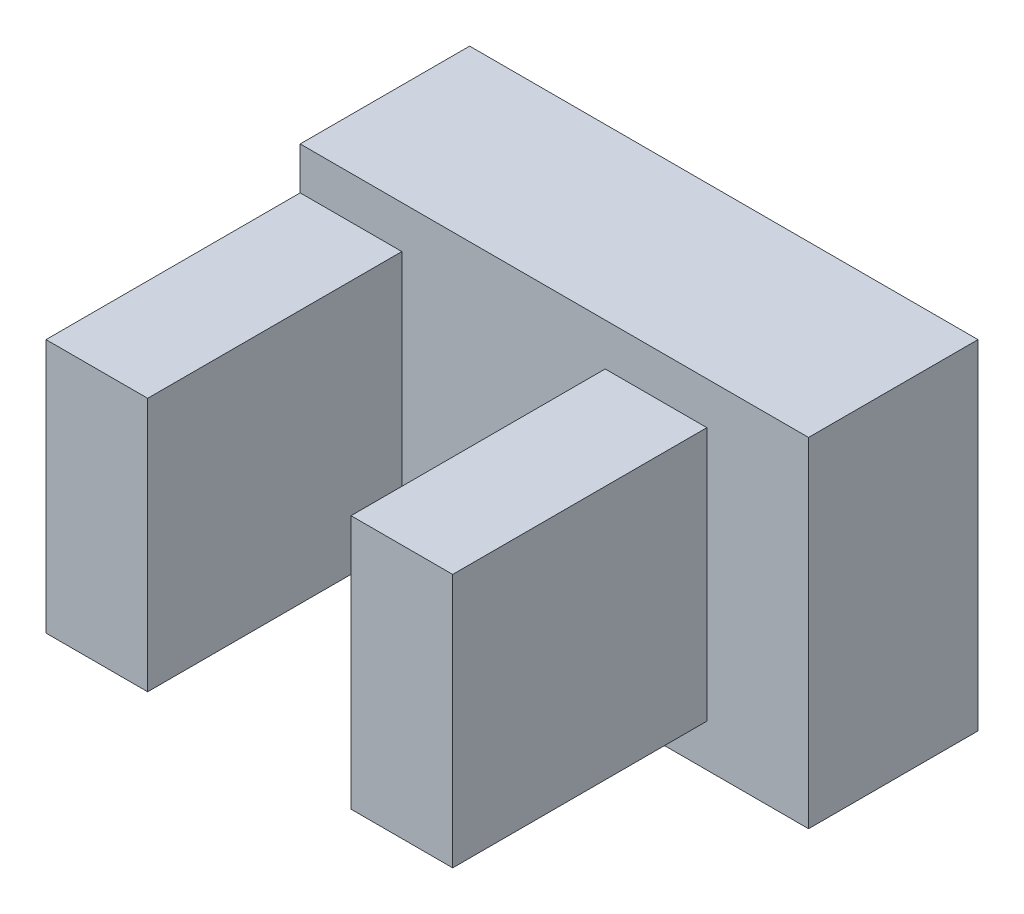
ISO-10303-21;
HEADER;
FILE_DESCRIPTION(('STEP AP214'),'2;1');
FILE_NAME('part.step','',(''),(''),'','','');
FILE_SCHEMA(('AUTOMOTIVE_DESIGN { 1 0 10303 214 1 1 1 1 }'));
ENDSEC;
DATA;
#1=APPLICATION_CONTEXT('core data for automotive mechanical design processes');
#2=APPLICATION_PROTOCOL_DEFINITION('international standard','automotive_design',2000,#1);
#3=PRODUCT_CONTEXT('',#1,'mechanical');
#4=PRODUCT('Part','Part','',(#3));
#5=PRODUCT_RELATED_PRODUCT_CATEGORY('part','',(#4));
#6=PRODUCT_DEFINITION_FORMATION('','',#4);
#7=PRODUCT_DEFINITION_CONTEXT('part definition',#1,'design');
#8=PRODUCT_DEFINITION('design','',#6,#7);
#9=PRODUCT_DEFINITION_SHAPE('','',#8);
#10=(LENGTH_UNIT() NAMED_UNIT(*) SI_UNIT(.MILLI.,.METRE.));
#11=(NAMED_UNIT(*) PLANE_ANGLE_UNIT() SI_UNIT($,.RADIAN.));
#12=(NAMED_UNIT(*) SI_UNIT($,.STERADIAN.) SOLID_ANGLE_UNIT());
#13=UNCERTAINTY_MEASURE_WITH_UNIT(LENGTH_MEASURE(1.E-05),#10,'distance_accuracy_value','');
#14=(GEOMETRIC_REPRESENTATION_CONTEXT(3) GLOBAL_UNCERTAINTY_ASSIGNED_CONTEXT((#13)) GLOBAL_UNIT_ASSIGNED_CONTEXT((#10,
#11,#12)) REPRESENTATION_CONTEXT('',''));
#15=CARTESIAN_POINT('',(0.,0.,0.));
#16=DIRECTION('',(0.,0.,1.));
#17=DIRECTION('',(1.,0.,0.));
#18=AXIS2_PLACEMENT_3D('',#15,#16,#17);
#19=CARTESIAN_POINT('',(0.,0.,20.));
#20=DIRECTION('',(0.,0.,1.));
#21=DIRECTION('',(1.,0.,0.));
#22=AXIS2_PLACEMENT_3D('',#19,#20,#21);
#23=PLANE('',#22);
#24=DIRECTION('',(-1.,0.,0.));
#25=VECTOR('',#24,1.);
#26=CARTESIAN_POINT('',(-30.,15.,20.));
#27=LINE('',#26,#25);
#28=CARTESIAN_POINT('',(-18.,15.,20.));
#29=VERTEX_POINT('',#28);
#30=CARTESIAN_POINT('',(-30.,15.,20.));
#31=VERTEX_POINT('',#30);
#32=EDGE_CURVE('E62',#29,#31,#27,.T.);
#33=ORIENTED_EDGE('',*,*,#32,.F.);
#34=DIRECTION('',(0.,1.,0.));
#35=VECTOR('',#34,1.);
#36=CARTESIAN_POINT('',(-18.,15.,20.));
#37=LINE('',#36,#35);
#38=CARTESIAN_POINT('',(-18.,-15.,20.));
#39=VERTEX_POINT('',#38);
#40=EDGE_CURVE('E156',#39,#29,#37,.T.);
#41=ORIENTED_EDGE('',*,*,#40,.F.);
#42=DIRECTION('',(1.,0.,0.));
#43=VECTOR('',#42,1.);
#44=CARTESIAN_POINT('',(-30.,-15.,20.));
#45=LINE('',#44,#43);
#46=CARTESIAN_POINT('',(-30.,-15.,20.));
#47=VERTEX_POINT('',#46);
#48=EDGE_CURVE('E153',#47,#39,#45,.T.);
#49=ORIENTED_EDGE('',*,*,#48,.F.);
#50=DIRECTION('',(0.,-1.,0.));
#51=VECTOR('',#50,1.);
#52=CARTESIAN_POINT('',(-30.,20.,20.));
#53=LINE('',#52,#51);
#54=CARTESIAN_POINT('',(-30.,-20.,20.));
#55=VERTEX_POINT('',#54);
#56=EDGE_CURVE('E188',#47,#55,#53,.T.);
#57=ORIENTED_EDGE('',*,*,#56,.T.);
#58=DIRECTION('',(1.,0.,0.));
#59=VECTOR('',#58,1.);
#60=CARTESIAN_POINT('',(-30.,-20.,20.));
#61=LINE('',#60,#59);
#62=CARTESIAN_POINT('',(30.,-20.,20.));
#63=VERTEX_POINT('',#62);
#64=EDGE_CURVE('E187',#55,#63,#61,.T.);
#65=ORIENTED_EDGE('',*,*,#64,.T.);
#66=DIRECTION('',(0.,1.,0.));
#67=VECTOR('',#66,1.);
#68=CARTESIAN_POINT('',(30.,20.,20.));
#69=LINE('',#68,#67);
#70=CARTESIAN_POINT('',(30.,20.,20.));
#71=VERTEX_POINT('',#70);
#72=EDGE_CURVE('E190',#63,#71,#69,.T.);
#73=ORIENTED_EDGE('',*,*,#72,.T.);
#74=DIRECTION('',(-1.,0.,0.));
#75=VECTOR('',#74,1.);
#76=CARTESIAN_POINT('',(-30.,20.,20.));
#77=LINE('',#76,#75);
#78=CARTESIAN_POINT('',(-30.,20.,20.));
#79=VERTEX_POINT('',#78);
#80=EDGE_CURVE('E192',#71,#79,#77,.T.);
#81=ORIENTED_EDGE('',*,*,#80,.T.);
#82=EDGE_CURVE('E185',#79,#31,#53,.T.);
#83=ORIENTED_EDGE('',*,*,#82,.T.);
#84=EDGE_LOOP('',(#33,#41,#49,#57,#65,#73,#81,#83));
#85=FACE_BOUND('',#84,.T.);
#86=DIRECTION('',(1.,0.,0.));
#87=VECTOR('',#86,1.);
#88=CARTESIAN_POINT('',(6.,-15.,20.));
#89=LINE('',#88,#87);
#90=CARTESIAN_POINT('',(6.,-15.,20.));
#91=VERTEX_POINT('',#90);
#92=CARTESIAN_POINT('',(18.,-15.,20.));
#93=VERTEX_POINT('',#92);
#94=EDGE_CURVE('E358',#91,#93,#89,.T.);
#95=ORIENTED_EDGE('',*,*,#94,.F.);
#96=DIRECTION('',(0.,-1.,0.));
#97=VECTOR('',#96,1.);
#98=CARTESIAN_POINT('',(6.,15.,20.));
#99=LINE('',#98,#97);
#100=CARTESIAN_POINT('',(6.,15.,20.));
#101=VERTEX_POINT('',#100);
#102=EDGE_CURVE('E151',#101,#91,#99,.T.);
#103=ORIENTED_EDGE('',*,*,#102,.F.);
#104=DIRECTION('',(-1.,0.,0.));
#105=VECTOR('',#104,1.);
#106=CARTESIAN_POINT('',(6.,15.,20.));
#107=LINE('',#106,#105);
#108=CARTESIAN_POINT('',(18.,15.,20.));
#109=VERTEX_POINT('',#108);
#110=EDGE_CURVE('E147',#109,#101,#107,.T.);
#111=ORIENTED_EDGE('',*,*,#110,.F.);
#112=DIRECTION('',(0.,1.,0.));
#113=VECTOR('',#112,1.);
#114=CARTESIAN_POINT('',(18.,15.,20.));
#115=LINE('',#114,#113);
#116=EDGE_CURVE('E355',#93,#109,#115,.T.);
#117=ORIENTED_EDGE('',*,*,#116,.F.);
#118=EDGE_LOOP('',(#95,#103,#111,#117));
#119=FACE_BOUND('',#118,.T.);
#120=ADVANCED_FACE('F39',(#85,#119),#23,.T.);
#121=CARTESIAN_POINT('',(-30.,20.,20.));
#122=DIRECTION('',(1.,0.,0.));
#123=DIRECTION('',(0.,0.,-1.));
#124=AXIS2_PLACEMENT_3D('',#121,#122,#123);
#125=PLANE('',#124);
#126=DIRECTION('',(0.,-1.,0.));
#127=VECTOR('',#126,1.);
#128=CARTESIAN_POINT('',(-30.,20.,0.));
#129=LINE('',#128,#127);
#130=CARTESIAN_POINT('',(-30.,20.,0.));
#131=VERTEX_POINT('',#130);
#132=CARTESIAN_POINT('',(-30.,-20.,0.));
#133=VERTEX_POINT('',#132);
#134=EDGE_CURVE('E184',#131,#133,#129,.T.);
#135=ORIENTED_EDGE('',*,*,#134,.T.);
#136=DIRECTION('',(0.,0.,-1.));
#137=VECTOR('',#136,1.);
#138=CARTESIAN_POINT('',(-30.,-20.,20.));
#139=LINE('',#138,#137);
#140=EDGE_CURVE('E11',#55,#133,#139,.T.);
#141=ORIENTED_EDGE('',*,*,#140,.F.);
#142=ORIENTED_EDGE('',*,*,#56,.F.);
#143=DIRECTION('',(0.,0.,-1.));
#144=VECTOR('',#143,1.);
#145=CARTESIAN_POINT('',(-30.,-15.,50.));
#146=LINE('',#145,#144);
#147=CARTESIAN_POINT('',(-30.,-15.,50.));
#148=VERTEX_POINT('',#147);
#149=EDGE_CURVE('E181',#148,#47,#146,.T.);
#150=ORIENTED_EDGE('',*,*,#149,.F.);
#151=DIRECTION('',(0.,-1.,0.));
#152=VECTOR('',#151,1.);
#153=CARTESIAN_POINT('',(-30.,15.,50.));
#154=LINE('',#153,#152);
#155=CARTESIAN_POINT('',(-30.,15.,50.));
#156=VERTEX_POINT('',#155);
#157=EDGE_CURVE('E161',#156,#148,#154,.T.);
#158=ORIENTED_EDGE('',*,*,#157,.F.);
#159=DIRECTION('',(0.,0.,-1.));
#160=VECTOR('',#159,1.);
#161=CARTESIAN_POINT('',(-30.,15.,50.));
#162=LINE('',#161,#160);
#163=EDGE_CURVE('E169',#156,#31,#162,.T.);
#164=ORIENTED_EDGE('',*,*,#163,.T.);
#165=ORIENTED_EDGE('',*,*,#82,.F.);
#166=DIRECTION('',(0.,0.,-1.));
#167=VECTOR('',#166,1.);
#168=CARTESIAN_POINT('',(-30.,20.,20.));
#169=LINE('',#168,#167);
#170=EDGE_CURVE('E194',#79,#131,#169,.T.);
#171=ORIENTED_EDGE('',*,*,#170,.T.);
#172=EDGE_LOOP('',(#135,#141,#142,#150,#158,#164,#165,#171));
#173=FACE_BOUND('',#172,.T.);
#174=ADVANCED_FACE('F41',(#173),#125,.F.);
#175=CARTESIAN_POINT('',(-30.,-20.,20.));
#176=DIRECTION('',(0.,1.,0.));
#177=DIRECTION('',(0.,0.,1.));
#178=AXIS2_PLACEMENT_3D('',#175,#176,#177);
#179=PLANE('',#178);
#180=DIRECTION('',(1.,0.,0.));
#181=VECTOR('',#180,1.);
#182=CARTESIAN_POINT('',(-30.,-20.,0.));
#183=LINE('',#182,#181);
#184=CARTESIAN_POINT('',(30.,-20.,0.));
#185=VERTEX_POINT('',#184);
#186=EDGE_CURVE('E197',#133,#185,#183,.T.);
#187=ORIENTED_EDGE('',*,*,#186,.T.);
#188=DIRECTION('',(0.,0.,-1.));
#189=VECTOR('',#188,1.);
#190=CARTESIAN_POINT('',(30.,-20.,20.));
#191=LINE('',#190,#189);
#192=EDGE_CURVE('E47',#63,#185,#191,.T.);
#193=ORIENTED_EDGE('',*,*,#192,.F.);
#194=ORIENTED_EDGE('',*,*,#64,.F.);
#195=ORIENTED_EDGE('',*,*,#140,.T.);
#196=EDGE_LOOP('',(#187,#193,#194,#195));
#197=FACE_BOUND('',#196,.T.);
#198=ADVANCED_FACE('F242',(#197),#179,.F.);
#199=CARTESIAN_POINT('',(30.,20.,20.));
#200=DIRECTION('',(-1.,0.,0.));
#201=DIRECTION('',(0.,0.,1.));
#202=AXIS2_PLACEMENT_3D('',#199,#200,#201);
#203=PLANE('',#202);
#204=DIRECTION('',(0.,1.,0.));
#205=VECTOR('',#204,1.);
#206=CARTESIAN_POINT('',(30.,20.,0.));
#207=LINE('',#206,#205);
#208=CARTESIAN_POINT('',(30.,20.,0.));
#209=VERTEX_POINT('',#208);
#210=EDGE_CURVE('E199',#185,#209,#207,.T.);
#211=ORIENTED_EDGE('',*,*,#210,.T.);
#212=DIRECTION('',(0.,0.,-1.));
#213=VECTOR('',#212,1.);
#214=CARTESIAN_POINT('',(30.,20.,20.));
#215=LINE('',#214,#213);
#216=EDGE_CURVE('E205',#71,#209,#215,.T.);
#217=ORIENTED_EDGE('',*,*,#216,.F.);
#218=ORIENTED_EDGE('',*,*,#72,.F.);
#219=ORIENTED_EDGE('',*,*,#192,.T.);
#220=EDGE_LOOP('',(#211,#217,#218,#219));
#221=FACE_BOUND('',#220,.T.);
#222=ADVANCED_FACE('F212',(#221),#203,.F.);
#223=CARTESIAN_POINT('',(-30.,20.,20.));
#224=DIRECTION('',(0.,-1.,0.));
#225=DIRECTION('',(0.,0.,-1.));
#226=AXIS2_PLACEMENT_3D('',#223,#224,#225);
#227=PLANE('',#226);
#228=DIRECTION('',(-1.,0.,0.));
#229=VECTOR('',#228,1.);
#230=CARTESIAN_POINT('',(-30.,20.,0.));
#231=LINE('',#230,#229);
#232=EDGE_CURVE('E201',#209,#131,#231,.T.);
#233=ORIENTED_EDGE('',*,*,#232,.T.);
#234=ORIENTED_EDGE('',*,*,#170,.F.);
#235=ORIENTED_EDGE('',*,*,#80,.F.);
#236=ORIENTED_EDGE('',*,*,#216,.T.);
#237=EDGE_LOOP('',(#233,#234,#235,#236));
#238=FACE_BOUND('',#237,.T.);
#239=ADVANCED_FACE('F222',(#238),#227,.F.);
#240=CARTESIAN_POINT('',(0.,0.,0.));
#241=DIRECTION('',(0.,0.,1.));
#242=DIRECTION('',(1.,0.,0.));
#243=AXIS2_PLACEMENT_3D('',#240,#241,#242);
#244=PLANE('',#243);
#245=ORIENTED_EDGE('',*,*,#134,.F.);
#246=ORIENTED_EDGE('',*,*,#232,.F.);
#247=ORIENTED_EDGE('',*,*,#210,.F.);
#248=ORIENTED_EDGE('',*,*,#186,.F.);
#249=EDGE_LOOP('',(#245,#246,#247,#248));
#250=FACE_BOUND('',#249,.T.);
#251=ADVANCED_FACE('F219',(#250),#244,.F.);
#252=CARTESIAN_POINT('',(-30.,-15.,50.));
#253=DIRECTION('',(0.,1.,0.));
#254=DIRECTION('',(0.,0.,1.));
#255=AXIS2_PLACEMENT_3D('',#252,#253,#254);
#256=PLANE('',#255);
#257=ORIENTED_EDGE('',*,*,#48,.T.);
#258=DIRECTION('',(0.,0.,-1.));
#259=VECTOR('',#258,1.);
#260=CARTESIAN_POINT('',(-18.,-15.,50.));
#261=LINE('',#260,#259);
#262=CARTESIAN_POINT('',(-18.,-15.,50.));
#263=VERTEX_POINT('',#262);
#264=EDGE_CURVE('E178',#263,#39,#261,.T.);
#265=ORIENTED_EDGE('',*,*,#264,.F.);
#266=DIRECTION('',(1.,0.,0.));
#267=VECTOR('',#266,1.);
#268=CARTESIAN_POINT('',(-30.,-15.,50.));
#269=LINE('',#268,#267);
#270=EDGE_CURVE('E164',#148,#263,#269,.T.);
#271=ORIENTED_EDGE('',*,*,#270,.F.);
#272=ORIENTED_EDGE('',*,*,#149,.T.);
#273=EDGE_LOOP('',(#257,#265,#271,#272));
#274=FACE_BOUND('',#273,.T.);
#275=ADVANCED_FACE('F240',(#274),#256,.F.);
#276=CARTESIAN_POINT('',(-18.,15.,50.));
#277=DIRECTION('',(-1.,0.,0.));
#278=DIRECTION('',(0.,0.,1.));
#279=AXIS2_PLACEMENT_3D('',#276,#277,#278);
#280=PLANE('',#279);
#281=ORIENTED_EDGE('',*,*,#40,.T.);
#282=DIRECTION('',(0.,0.,-1.));
#283=VECTOR('',#282,1.);
#284=CARTESIAN_POINT('',(-18.,15.,50.));
#285=LINE('',#284,#283);
#286=CARTESIAN_POINT('',(-18.,15.,50.));
#287=VERTEX_POINT('',#286);
#288=EDGE_CURVE('E175',#287,#29,#285,.T.);
#289=ORIENTED_EDGE('',*,*,#288,.F.);
#290=DIRECTION('',(0.,1.,0.));
#291=VECTOR('',#290,1.);
#292=CARTESIAN_POINT('',(-18.,15.,50.));
#293=LINE('',#292,#291);
#294=EDGE_CURVE('E166',#263,#287,#293,.T.);
#295=ORIENTED_EDGE('',*,*,#294,.F.);
#296=ORIENTED_EDGE('',*,*,#264,.T.);
#297=EDGE_LOOP('',(#281,#289,#295,#296));
#298=FACE_BOUND('',#297,.T.);
#299=ADVANCED_FACE('F236',(#298),#280,.F.);
#300=CARTESIAN_POINT('',(-30.,15.,50.));
#301=DIRECTION('',(0.,-1.,0.));
#302=DIRECTION('',(0.,0.,-1.));
#303=AXIS2_PLACEMENT_3D('',#300,#301,#302);
#304=PLANE('',#303);
#305=ORIENTED_EDGE('',*,*,#32,.T.);
#306=ORIENTED_EDGE('',*,*,#163,.F.);
#307=DIRECTION('',(-1.,0.,0.));
#308=VECTOR('',#307,1.);
#309=CARTESIAN_POINT('',(-30.,15.,50.));
#310=LINE('',#309,#308);
#311=EDGE_CURVE('E168',#287,#156,#310,.T.);
#312=ORIENTED_EDGE('',*,*,#311,.F.);
#313=ORIENTED_EDGE('',*,*,#288,.T.);
#314=EDGE_LOOP('',(#305,#306,#312,#313));
#315=FACE_BOUND('',#314,.T.);
#316=ADVANCED_FACE('F231',(#315),#304,.F.);
#317=CARTESIAN_POINT('',(0.,0.,50.));
#318=DIRECTION('',(0.,0.,1.));
#319=DIRECTION('',(1.,0.,0.));
#320=AXIS2_PLACEMENT_3D('',#317,#318,#319);
#321=PLANE('',#320);
#322=ORIENTED_EDGE('',*,*,#157,.T.);
#323=ORIENTED_EDGE('',*,*,#270,.T.);
#324=ORIENTED_EDGE('',*,*,#294,.T.);
#325=ORIENTED_EDGE('',*,*,#311,.T.);
#326=EDGE_LOOP('',(#322,#323,#324,#325));
#327=FACE_BOUND('',#326,.T.);
#328=ADVANCED_FACE('F293',(#327),#321,.T.);
#329=CARTESIAN_POINT('',(6.,15.,50.));
#330=DIRECTION('',(1.,0.,0.));
#331=DIRECTION('',(0.,0.,-1.));
#332=AXIS2_PLACEMENT_3D('',#329,#330,#331);
#333=PLANE('',#332);
#334=ORIENTED_EDGE('',*,*,#102,.T.);
#335=DIRECTION('',(0.,0.,-1.));
#336=VECTOR('',#335,1.);
#337=CARTESIAN_POINT('',(6.,-15.,50.));
#338=LINE('',#337,#336);
#339=CARTESIAN_POINT('',(6.,-15.,50.));
#340=VERTEX_POINT('',#339);
#341=EDGE_CURVE('E132',#340,#91,#338,.T.);
#342=ORIENTED_EDGE('',*,*,#341,.F.);
#343=DIRECTION('',(0.,-1.,0.));
#344=VECTOR('',#343,1.);
#345=CARTESIAN_POINT('',(6.,15.,50.));
#346=LINE('',#345,#344);
#347=CARTESIAN_POINT('',(6.,15.,50.));
#348=VERTEX_POINT('',#347);
#349=EDGE_CURVE('E139',#348,#340,#346,.T.);
#350=ORIENTED_EDGE('',*,*,#349,.F.);
#351=DIRECTION('',(0.,0.,-1.));
#352=VECTOR('',#351,1.);
#353=CARTESIAN_POINT('',(6.,15.,50.));
#354=LINE('',#353,#352);
#355=EDGE_CURVE('E353',#348,#101,#354,.T.);
#356=ORIENTED_EDGE('',*,*,#355,.T.);
#357=EDGE_LOOP('',(#334,#342,#350,#356));
#358=FACE_BOUND('',#357,.T.);
#359=ADVANCED_FACE('F149',(#358),#333,.F.);
#360=CARTESIAN_POINT('',(6.,-15.,50.));
#361=DIRECTION('',(0.,1.,0.));
#362=DIRECTION('',(0.,0.,1.));
#363=AXIS2_PLACEMENT_3D('',#360,#361,#362);
#364=PLANE('',#363);
#365=ORIENTED_EDGE('',*,*,#94,.T.);
#366=DIRECTION('',(0.,0.,-1.));
#367=VECTOR('',#366,1.);
#368=CARTESIAN_POINT('',(18.,-15.,50.));
#369=LINE('',#368,#367);
#370=CARTESIAN_POINT('',(18.,-15.,50.));
#371=VERTEX_POINT('',#370);
#372=EDGE_CURVE('E135',#371,#93,#369,.T.);
#373=ORIENTED_EDGE('',*,*,#372,.F.);
#374=DIRECTION('',(1.,0.,0.));
#375=VECTOR('',#374,1.);
#376=CARTESIAN_POINT('',(6.,-15.,50.));
#377=LINE('',#376,#375);
#378=EDGE_CURVE('E128',#340,#371,#377,.T.);
#379=ORIENTED_EDGE('',*,*,#378,.F.);
#380=ORIENTED_EDGE('',*,*,#341,.T.);
#381=EDGE_LOOP('',(#365,#373,#379,#380));
#382=FACE_BOUND('',#381,.T.);
#383=ADVANCED_FACE('F130',(#382),#364,.F.);
#384=CARTESIAN_POINT('',(18.,15.,50.));
#385=DIRECTION('',(-1.,0.,0.));
#386=DIRECTION('',(0.,0.,1.));
#387=AXIS2_PLACEMENT_3D('',#384,#385,#386);
#388=PLANE('',#387);
#389=ORIENTED_EDGE('',*,*,#116,.T.);
#390=DIRECTION('',(0.,0.,-1.));
#391=VECTOR('',#390,1.);
#392=CARTESIAN_POINT('',(18.,15.,50.));
#393=LINE('',#392,#391);
#394=CARTESIAN_POINT('',(18.,15.,50.));
#395=VERTEX_POINT('',#394);
#396=EDGE_CURVE('E54',#395,#109,#393,.T.);
#397=ORIENTED_EDGE('',*,*,#396,.F.);
#398=DIRECTION('',(0.,1.,0.));
#399=VECTOR('',#398,1.);
#400=CARTESIAN_POINT('',(18.,15.,50.));
#401=LINE('',#400,#399);
#402=EDGE_CURVE('E138',#371,#395,#401,.T.);
#403=ORIENTED_EDGE('',*,*,#402,.F.);
#404=ORIENTED_EDGE('',*,*,#372,.T.);
#405=EDGE_LOOP('',(#389,#397,#403,#404));
#406=FACE_BOUND('',#405,.T.);
#407=ADVANCED_FACE('F323',(#406),#388,.F.);
#408=CARTESIAN_POINT('',(6.,15.,50.));
#409=DIRECTION('',(0.,-1.,0.));
#410=DIRECTION('',(0.,0.,-1.));
#411=AXIS2_PLACEMENT_3D('',#408,#409,#410);
#412=PLANE('',#411);
#413=ORIENTED_EDGE('',*,*,#110,.T.);
#414=ORIENTED_EDGE('',*,*,#355,.F.);
#415=DIRECTION('',(-1.,0.,0.));
#416=VECTOR('',#415,1.);
#417=CARTESIAN_POINT('',(6.,15.,50.));
#418=LINE('',#417,#416);
#419=EDGE_CURVE('E143',#395,#348,#418,.T.);
#420=ORIENTED_EDGE('',*,*,#419,.F.);
#421=ORIENTED_EDGE('',*,*,#396,.T.);
#422=EDGE_LOOP('',(#413,#414,#420,#421));
#423=FACE_BOUND('',#422,.T.);
#424=ADVANCED_FACE('F332',(#423),#412,.F.);
#425=CARTESIAN_POINT('',(0.,0.,50.));
#426=DIRECTION('',(0.,0.,1.));
#427=DIRECTION('',(1.,0.,0.));
#428=AXIS2_PLACEMENT_3D('',#425,#426,#427);
#429=PLANE('',#428);
#430=ORIENTED_EDGE('',*,*,#349,.T.);
#431=ORIENTED_EDGE('',*,*,#378,.T.);
#432=ORIENTED_EDGE('',*,*,#402,.T.);
#433=ORIENTED_EDGE('',*,*,#419,.T.);
#434=EDGE_LOOP('',(#430,#431,#432,#433));
#435=FACE_BOUND('',#434,.T.);
#436=ADVANCED_FACE('F142',(#435),#429,.T.);
#437=CLOSED_SHELL('',(#120,#174,#198,#222,#239,#251,#275,#299,#316,#328,#359,#383,#407,#424,#436));
#438=MANIFOLD_SOLID_BREP('B2',#437);
#439=ADVANCED_BREP_SHAPE_REPRESENTATION('',(#18,#438),#14);
#440=SHAPE_DEFINITION_REPRESENTATION(#9,#439);
ENDSEC;
END-ISO-10303-21;
